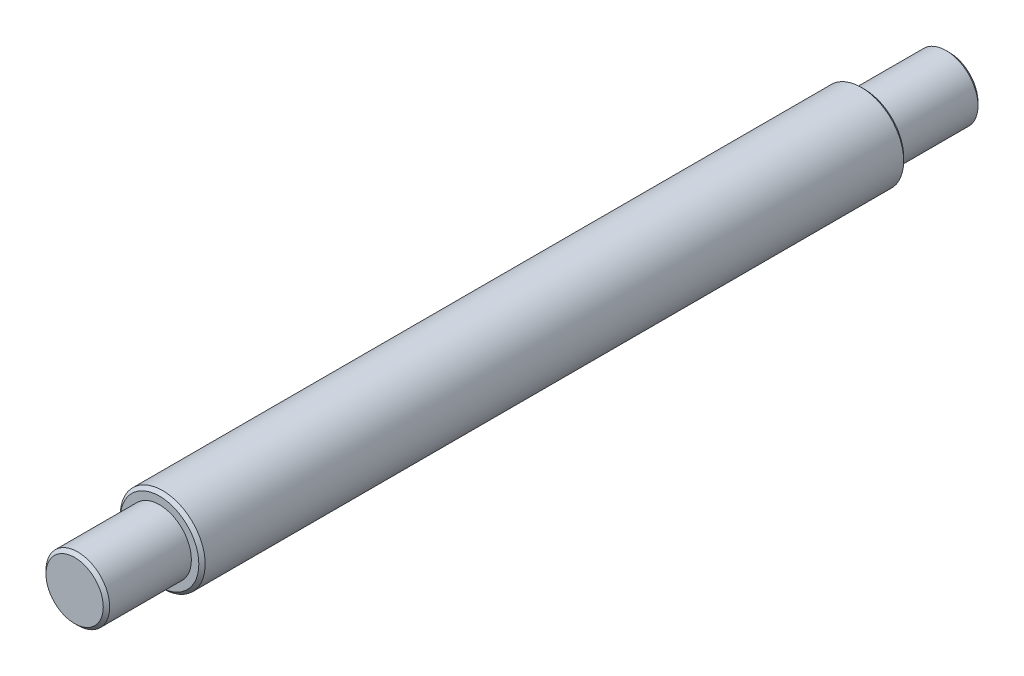
ISO-10303-21;
HEADER;
FILE_DESCRIPTION(('STEP AP214'),'2;1');
FILE_NAME('part.step','',(''),(''),'','','');
FILE_SCHEMA(('AUTOMOTIVE_DESIGN { 1 0 10303 214 1 1 1 1 }'));
ENDSEC;
DATA;
#1=APPLICATION_CONTEXT('core data for automotive mechanical design processes');
#2=APPLICATION_PROTOCOL_DEFINITION('international standard','automotive_design',2000,#1);
#3=PRODUCT_CONTEXT('',#1,'mechanical');
#4=PRODUCT('Part','Part','',(#3));
#5=PRODUCT_RELATED_PRODUCT_CATEGORY('part','',(#4));
#6=PRODUCT_DEFINITION_FORMATION('','',#4);
#7=PRODUCT_DEFINITION_CONTEXT('part definition',#1,'design');
#8=PRODUCT_DEFINITION('design','',#6,#7);
#9=PRODUCT_DEFINITION_SHAPE('','',#8);
#10=(LENGTH_UNIT() NAMED_UNIT(*) SI_UNIT(.MILLI.,.METRE.));
#11=(NAMED_UNIT(*) PLANE_ANGLE_UNIT() SI_UNIT($,.RADIAN.));
#12=(NAMED_UNIT(*) SI_UNIT($,.STERADIAN.) SOLID_ANGLE_UNIT());
#13=UNCERTAINTY_MEASURE_WITH_UNIT(LENGTH_MEASURE(1.E-05),#10,'distance_accuracy_value','');
#14=(GEOMETRIC_REPRESENTATION_CONTEXT(3) GLOBAL_UNCERTAINTY_ASSIGNED_CONTEXT((#13)) GLOBAL_UNIT_ASSIGNED_CONTEXT((#10,
#11,#12)) REPRESENTATION_CONTEXT('',''));
#15=CARTESIAN_POINT('',(0.,0.,0.));
#16=DIRECTION('',(0.,0.,1.));
#17=DIRECTION('',(1.,0.,0.));
#18=AXIS2_PLACEMENT_3D('',#15,#16,#17);
#19=CARTESIAN_POINT('',(0.,0.,33.2));
#20=DIRECTION('',(0.,0.,-1.));
#21=DIRECTION('',(-1.,0.,0.));
#22=AXIS2_PLACEMENT_3D('',#19,#20,#21);
#23=CYLINDRICAL_SURFACE('',#22,4.);
#24=CARTESIAN_POINT('',(0.,0.,-32.8999999999999));
#25=DIRECTION('',(0.,0.,1.));
#26=DIRECTION('',(1.,0.,0.));
#27=AXIS2_PLACEMENT_3D('',#24,#25,#26);
#28=CIRCLE('',#27,4.);
#29=CARTESIAN_POINT('',(-4.,0.,-32.8999999999999));
#30=VERTEX_POINT('',#29);
#31=EDGE_CURVE('E64',#30,#30,#28,.T.);
#32=CARTESIAN_POINT('',(0.,0.,32.9));
#33=DIRECTION('',(0.,0.,1.));
#34=DIRECTION('',(1.,0.,0.));
#35=AXIS2_PLACEMENT_3D('',#32,#33,#34);
#36=CIRCLE('',#35,4.);
#37=CARTESIAN_POINT('',(-4.,0.,32.9));
#38=VERTEX_POINT('',#37);
#39=EDGE_CURVE('E68',#38,#38,#36,.F.);
#40=CARTESIAN_POINT('',(-4.,0.,-32.8999999999999));
#41=CARTESIAN_POINT('',(-4.,0.,-32.2145833333333));
#42=CARTESIAN_POINT('',(-4.,0.,-31.5291666666666));
#43=CARTESIAN_POINT('',(-4.,0.,-30.1583333333333));
#44=CARTESIAN_POINT('',(-4.,0.,-29.4729166666666));
#45=CARTESIAN_POINT('',(-4.,0.,-28.1020833333333));
#46=CARTESIAN_POINT('',(-4.,0.,-27.4166666666666));
#47=CARTESIAN_POINT('',(-4.,0.,-26.0458333333333));
#48=CARTESIAN_POINT('',(-4.,0.,-25.3604166666666));
#49=CARTESIAN_POINT('',(-4.,0.,-23.9895833333333));
#50=CARTESIAN_POINT('',(-4.,0.,-23.3041666666666));
#51=CARTESIAN_POINT('',(-4.,0.,-21.9333333333333));
#52=CARTESIAN_POINT('',(-4.,0.,-21.2479166666666));
#53=CARTESIAN_POINT('',(-4.,0.,-19.8770833333333));
#54=CARTESIAN_POINT('',(-4.,0.,-19.1916666666666));
#55=CARTESIAN_POINT('',(-4.,0.,-17.8208333333333));
#56=CARTESIAN_POINT('',(-4.,0.,-17.1354166666666));
#57=CARTESIAN_POINT('',(-4.,0.,-15.7645833333333));
#58=CARTESIAN_POINT('',(-4.,0.,-15.0791666666666));
#59=CARTESIAN_POINT('',(-4.,0.,-13.7083333333333));
#60=CARTESIAN_POINT('',(-4.,0.,-13.0229166666666));
#61=CARTESIAN_POINT('',(-4.,0.,-11.6520833333333));
#62=CARTESIAN_POINT('',(-4.,0.,-10.9666666666666));
#63=CARTESIAN_POINT('',(-4.,0.,-9.59583333333327));
#64=CARTESIAN_POINT('',(-4.,0.,-8.91041666666661));
#65=CARTESIAN_POINT('',(-4.,0.,-7.53958333333328));
#66=CARTESIAN_POINT('',(-4.,0.,-6.85416666666661));
#67=CARTESIAN_POINT('',(-4.,0.,-5.48333333333328));
#68=CARTESIAN_POINT('',(-4.,0.,-4.79791666666661));
#69=CARTESIAN_POINT('',(-4.,0.,-3.42708333333328));
#70=CARTESIAN_POINT('',(-4.,0.,-2.74166666666661));
#71=CARTESIAN_POINT('',(-4.,0.,-1.37083333333327));
#72=CARTESIAN_POINT('',(-4.,0.,-0.68541666666661));
#73=CARTESIAN_POINT('',(-4.,0.,0.68541666666672));
#74=CARTESIAN_POINT('',(-4.,0.,1.37083333333338));
#75=CARTESIAN_POINT('',(-4.,0.,2.74166666666672));
#76=CARTESIAN_POINT('',(-4.,0.,3.42708333333338));
#77=CARTESIAN_POINT('',(-4.,0.,4.79791666666672));
#78=CARTESIAN_POINT('',(-4.,0.,5.48333333333338));
#79=CARTESIAN_POINT('',(-4.,0.,6.85416666666672));
#80=CARTESIAN_POINT('',(-4.,0.,7.53958333333338));
#81=CARTESIAN_POINT('',(-4.,0.,8.91041666666671));
#82=CARTESIAN_POINT('',(-4.,0.,9.59583333333338));
#83=CARTESIAN_POINT('',(-4.,0.,10.9666666666667));
#84=CARTESIAN_POINT('',(-4.,0.,11.6520833333334));
#85=CARTESIAN_POINT('',(-4.,0.,13.0229166666667));
#86=CARTESIAN_POINT('',(-4.,0.,13.7083333333334));
#87=CARTESIAN_POINT('',(-4.,0.,15.0791666666667));
#88=CARTESIAN_POINT('',(-4.,0.,15.7645833333334));
#89=CARTESIAN_POINT('',(-4.,0.,17.1354166666667));
#90=CARTESIAN_POINT('',(-4.,0.,17.8208333333334));
#91=CARTESIAN_POINT('',(-4.,0.,19.1916666666667));
#92=CARTESIAN_POINT('',(-4.,0.,19.8770833333334));
#93=CARTESIAN_POINT('',(-4.,0.,21.2479166666667));
#94=CARTESIAN_POINT('',(-4.,0.,21.9333333333334));
#95=CARTESIAN_POINT('',(-4.,0.,23.3041666666667));
#96=CARTESIAN_POINT('',(-4.,0.,23.9895833333334));
#97=CARTESIAN_POINT('',(-4.,0.,25.3604166666667));
#98=CARTESIAN_POINT('',(-4.,0.,26.0458333333334));
#99=CARTESIAN_POINT('',(-4.,0.,27.4166666666667));
#100=CARTESIAN_POINT('',(-4.,0.,28.1020833333334));
#101=CARTESIAN_POINT('',(-4.,0.,29.4729166666667));
#102=CARTESIAN_POINT('',(-4.,0.,30.1583333333334));
#103=CARTESIAN_POINT('',(-4.,0.,31.5291666666667));
#104=CARTESIAN_POINT('',(-4.,0.,32.2145833333334));
#105=CARTESIAN_POINT('',(-4.,0.,32.9));
#106=B_SPLINE_CURVE_WITH_KNOTS('',3,(#40,#41,#42,#43,#44,#45,#46,#47,#48,#49,#50,#51,#52,#53,
#54,#55,#56,#57,#58,#59,#60,#61,#62,#63,#64,#65,#66,#67,#68,#69,#70,#71,#72,#73,#74,#75,#76,#77,
#78,#79,#80,#81,#82,#83,#84,#85,#86,#87,#88,#89,#90,#91,#92,#93,#94,#95,#96,#97,#98,#99,#100,
#101,#102,#103,#104,#105),.UNSPECIFIED.,.F.,.F.,(4,2,2,2,2,2,2,2,2,2,2,2,2,2,2,2,2,2,2,2,2,2,2,
2,2,2,2,2,2,2,2,2,4),(0.,2.05625,4.11249999999999,6.16874999999999,8.22499999999999,10.28125,
12.3375,14.39375,16.45,18.50625,20.5625,22.61875,24.675,26.73125,28.7875,30.84375,32.9,34.95625,
37.0125,39.06875,41.125,43.18125,45.2375,47.29375,49.35,51.40625,53.4625,55.51875,57.575,
59.63125,61.6875,63.74375,65.8),.UNSPECIFIED.);
#107=EDGE_CURVE('BSEAM39',#30,#38,#106,.T.);
#108=ORIENTED_EDGE('',*,*,#31,.T.);
#109=ORIENTED_EDGE('',*,*,#39,.T.);
#110=ORIENTED_EDGE('',*,*,#107,.T.);
#111=ORIENTED_EDGE('',*,*,#107,.F.);
#112=EDGE_LOOP('',(#108,#110,#109,#111));
#113=FACE_BOUND('',#112,.T.);
#114=ADVANCED_FACE('F39',(#113),#23,.T.);
#115=CARTESIAN_POINT('',(0.,0.,33.2));
#116=DIRECTION('',(0.,0.,1.));
#117=DIRECTION('',(1.,0.,0.));
#118=AXIS2_PLACEMENT_3D('',#115,#116,#117);
#119=PLANE('',#118);
#120=CARTESIAN_POINT('',(0.,0.,33.2));
#121=DIRECTION('',(0.,0.,1.));
#122=DIRECTION('',(1.,0.,0.));
#123=AXIS2_PLACEMENT_3D('',#120,#121,#122);
#124=CIRCLE('',#123,3.70000000000004);
#125=CARTESIAN_POINT('',(3.70000000000004,0.,33.2));
#126=VERTEX_POINT('',#125);
#127=EDGE_CURVE('E53',#126,#126,#124,.T.);
#128=ORIENTED_EDGE('',*,*,#127,.T.);
#129=EDGE_LOOP('',(#128));
#130=FACE_BOUND('',#129,.T.);
#131=CARTESIAN_POINT('',(0.,0.,33.2));
#132=DIRECTION('',(0.,0.,1.));
#133=DIRECTION('',(1.,0.,0.));
#134=AXIS2_PLACEMENT_3D('',#131,#132,#133);
#135=CIRCLE('',#134,3.);
#136=CARTESIAN_POINT('',(3.,0.,33.2));
#137=VERTEX_POINT('',#136);
#138=EDGE_CURVE('E80',#137,#137,#135,.T.);
#139=ORIENTED_EDGE('',*,*,#138,.F.);
#140=EDGE_LOOP('',(#139));
#141=FACE_BOUND('',#140,.T.);
#142=ADVANCED_FACE('F107',(#130,#141),#119,.T.);
#143=CARTESIAN_POINT('',(0.,0.,-33.2));
#144=DIRECTION('',(0.,0.,1.));
#145=DIRECTION('',(1.,0.,0.));
#146=AXIS2_PLACEMENT_3D('',#143,#144,#145);
#147=PLANE('',#146);
#148=CARTESIAN_POINT('',(0.,0.,-33.2));
#149=DIRECTION('',(0.,0.,1.));
#150=DIRECTION('',(1.,0.,0.));
#151=AXIS2_PLACEMENT_3D('',#148,#149,#150);
#152=CIRCLE('',#151,3.69999999999992);
#153=CARTESIAN_POINT('',(3.69999999999992,0.,-33.2));
#154=VERTEX_POINT('',#153);
#155=EDGE_CURVE('E58',#154,#154,#152,.F.);
#156=ORIENTED_EDGE('',*,*,#155,.T.);
#157=EDGE_LOOP('',(#156));
#158=FACE_BOUND('',#157,.T.);
#159=CARTESIAN_POINT('',(0.,0.,-33.2));
#160=DIRECTION('',(0.,0.,1.));
#161=DIRECTION('',(1.,0.,0.));
#162=AXIS2_PLACEMENT_3D('',#159,#160,#161);
#163=CIRCLE('',#162,3.);
#164=CARTESIAN_POINT('',(3.,0.,-33.2));
#165=VERTEX_POINT('',#164);
#166=EDGE_CURVE('E84',#165,#165,#163,.T.);
#167=ORIENTED_EDGE('',*,*,#166,.T.);
#168=EDGE_LOOP('',(#167));
#169=FACE_BOUND('',#168,.T.);
#170=ADVANCED_FACE('F89',(#158,#169),#147,.F.);
#171=CARTESIAN_POINT('',(0.,0.,41.2));
#172=DIRECTION('',(0.,0.,-1.));
#173=DIRECTION('',(-1.,0.,0.));
#174=AXIS2_PLACEMENT_3D('',#171,#172,#173);
#175=CYLINDRICAL_SURFACE('',#174,3.);
#176=CARTESIAN_POINT('',(0.,0.,40.9));
#177=DIRECTION('',(0.,0.,1.));
#178=DIRECTION('',(1.,0.,0.));
#179=AXIS2_PLACEMENT_3D('',#176,#177,#178);
#180=CIRCLE('',#179,3.);
#181=CARTESIAN_POINT('',(3.,0.,40.9));
#182=VERTEX_POINT('',#181);
#183=EDGE_CURVE('E10',#182,#182,#180,.F.);
#184=ORIENTED_EDGE('',*,*,#183,.T.);
#185=EDGE_LOOP('',(#184));
#186=FACE_BOUND('',#185,.T.);
#187=ORIENTED_EDGE('',*,*,#138,.T.);
#188=EDGE_LOOP('',(#187));
#189=FACE_BOUND('',#188,.T.);
#190=ADVANCED_FACE('F104',(#186,#189),#175,.T.);
#191=CARTESIAN_POINT('',(0.,0.,41.2));
#192=DIRECTION('',(0.,0.,1.));
#193=DIRECTION('',(1.,0.,0.));
#194=AXIS2_PLACEMENT_3D('',#191,#192,#193);
#195=PLANE('',#194);
#196=CARTESIAN_POINT('',(0.,0.,41.2));
#197=DIRECTION('',(0.,0.,1.));
#198=DIRECTION('',(1.,0.,0.));
#199=AXIS2_PLACEMENT_3D('',#196,#197,#198);
#200=CIRCLE('',#199,2.69999999999999);
#201=CARTESIAN_POINT('',(2.69999999999999,0.,41.2));
#202=VERTEX_POINT('',#201);
#203=EDGE_CURVE('E48',#202,#202,#200,.T.);
#204=ORIENTED_EDGE('',*,*,#203,.T.);
#205=EDGE_LOOP('',(#204));
#206=FACE_BOUND('',#205,.T.);
#207=ADVANCED_FACE('F94',(#206),#195,.T.);
#208=CARTESIAN_POINT('',(0.,0.,-41.2));
#209=DIRECTION('',(0.,0.,1.));
#210=DIRECTION('',(1.,0.,0.));
#211=AXIS2_PLACEMENT_3D('',#208,#209,#210);
#212=CYLINDRICAL_SURFACE('',#211,3.);
#213=CARTESIAN_POINT('',(0.,0.,-40.9));
#214=DIRECTION('',(0.,0.,-1.));
#215=DIRECTION('',(-1.,0.,0.));
#216=AXIS2_PLACEMENT_3D('',#213,#214,#215);
#217=CIRCLE('',#216,3.);
#218=CARTESIAN_POINT('',(-3.,0.,-40.9));
#219=VERTEX_POINT('',#218);
#220=EDGE_CURVE('E76',#219,#219,#217,.F.);
#221=ORIENTED_EDGE('',*,*,#220,.T.);
#222=EDGE_LOOP('',(#221));
#223=FACE_BOUND('',#222,.T.);
#224=ORIENTED_EDGE('',*,*,#166,.F.);
#225=EDGE_LOOP('',(#224));
#226=FACE_BOUND('',#225,.T.);
#227=ADVANCED_FACE('F91',(#223,#226),#212,.T.);
#228=CARTESIAN_POINT('',(0.,0.,-41.2));
#229=DIRECTION('',(0.,0.,-1.));
#230=DIRECTION('',(1.,0.,0.));
#231=AXIS2_PLACEMENT_3D('',#228,#229,#230);
#232=PLANE('',#231);
#233=CARTESIAN_POINT('',(0.,0.,-41.2));
#234=DIRECTION('',(0.,0.,-1.));
#235=DIRECTION('',(-1.,0.,0.));
#236=AXIS2_PLACEMENT_3D('',#233,#234,#235);
#237=CIRCLE('',#236,2.69999999999999);
#238=CARTESIAN_POINT('',(-2.69999999999999,0.,-41.2));
#239=VERTEX_POINT('',#238);
#240=EDGE_CURVE('E72',#239,#239,#237,.T.);
#241=ORIENTED_EDGE('',*,*,#240,.T.);
#242=EDGE_LOOP('',(#241));
#243=FACE_BOUND('',#242,.T.);
#244=ADVANCED_FACE('F93',(#243),#232,.T.);
#245=CARTESIAN_POINT('',(0.,0.,-40.9));
#246=DIRECTION('',(0.,0.,1.));
#247=DIRECTION('',(1.,0.,0.));
#248=AXIS2_PLACEMENT_3D('',#245,#246,#247);
#249=CONICAL_SURFACE('',#248,3.,0.785398163397445);
#250=ORIENTED_EDGE('',*,*,#240,.F.);
#251=EDGE_LOOP('',(#250));
#252=FACE_BOUND('',#251,.T.);
#253=ORIENTED_EDGE('',*,*,#220,.F.);
#254=EDGE_LOOP('',(#253));
#255=FACE_BOUND('',#254,.T.);
#256=ADVANCED_FACE('F101',(#252,#255),#249,.T.);
#257=CARTESIAN_POINT('',(0.,0.,-32.8999999999999));
#258=DIRECTION('',(0.,0.,1.));
#259=DIRECTION('',(1.,0.,0.));
#260=AXIS2_PLACEMENT_3D('',#257,#258,#259);
#261=CONICAL_SURFACE('',#260,4.,0.785398163397444);
#262=ORIENTED_EDGE('',*,*,#155,.F.);
#263=EDGE_LOOP('',(#262));
#264=FACE_BOUND('',#263,.T.);
#265=ORIENTED_EDGE('',*,*,#31,.F.);
#266=EDGE_LOOP('',(#265));
#267=FACE_BOUND('',#266,.T.);
#268=ADVANCED_FACE('F124',(#264,#267),#261,.T.);
#269=CARTESIAN_POINT('',(0.,0.,33.2));
#270=DIRECTION('',(0.,0.,-1.));
#271=DIRECTION('',(-1.,0.,0.));
#272=AXIS2_PLACEMENT_3D('',#269,#270,#271);
#273=CONICAL_SURFACE('',#272,3.70000000000004,0.785398163397444);
#274=ORIENTED_EDGE('',*,*,#39,.F.);
#275=EDGE_LOOP('',(#274));
#276=FACE_BOUND('',#275,.T.);
#277=ORIENTED_EDGE('',*,*,#127,.F.);
#278=EDGE_LOOP('',(#277));
#279=FACE_BOUND('',#278,.T.);
#280=ADVANCED_FACE('F130',(#276,#279),#273,.T.);
#281=CARTESIAN_POINT('',(0.,0.,41.2));
#282=DIRECTION('',(0.,0.,-1.));
#283=DIRECTION('',(-1.,0.,0.));
#284=AXIS2_PLACEMENT_3D('',#281,#282,#283);
#285=CONICAL_SURFACE('',#284,2.69999999999999,0.785398163397445);
#286=ORIENTED_EDGE('',*,*,#183,.F.);
#287=EDGE_LOOP('',(#286));
#288=FACE_BOUND('',#287,.T.);
#289=ORIENTED_EDGE('',*,*,#203,.F.);
#290=EDGE_LOOP('',(#289));
#291=FACE_BOUND('',#290,.T.);
#292=ADVANCED_FACE('F42',(#288,#291),#285,.T.);
#293=CLOSED_SHELL('',(#114,#142,#170,#190,#207,#227,#244,#256,#268,#280,#292));
#294=MANIFOLD_SOLID_BREP('B2',#293);
#295=ADVANCED_BREP_SHAPE_REPRESENTATION('',(#18,#294),#14);
#296=SHAPE_DEFINITION_REPRESENTATION(#9,#295);
ENDSEC;
END-ISO-10303-21;
